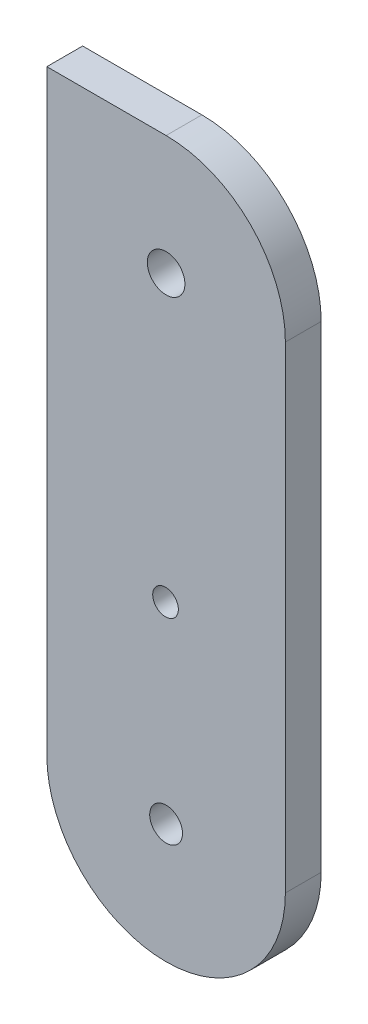
ISO-10303-21;
HEADER;
FILE_DESCRIPTION(('STEP AP214'),'2;1');
FILE_NAME('part.step','',(''),(''),'','','');
FILE_SCHEMA(('AUTOMOTIVE_DESIGN { 1 0 10303 214 1 1 1 1 }'));
ENDSEC;
DATA;
#1=APPLICATION_CONTEXT('core data for automotive mechanical design processes');
#2=APPLICATION_PROTOCOL_DEFINITION('international standard','automotive_design',2000,#1);
#3=PRODUCT_CONTEXT('',#1,'mechanical');
#4=PRODUCT('Part','Part','',(#3));
#5=PRODUCT_RELATED_PRODUCT_CATEGORY('part','',(#4));
#6=PRODUCT_DEFINITION_FORMATION('','',#4);
#7=PRODUCT_DEFINITION_CONTEXT('part definition',#1,'design');
#8=PRODUCT_DEFINITION('design','',#6,#7);
#9=PRODUCT_DEFINITION_SHAPE('','',#8);
#10=(LENGTH_UNIT() NAMED_UNIT(*) SI_UNIT(.MILLI.,.METRE.));
#11=(NAMED_UNIT(*) PLANE_ANGLE_UNIT() SI_UNIT($,.RADIAN.));
#12=(NAMED_UNIT(*) SI_UNIT($,.STERADIAN.) SOLID_ANGLE_UNIT());
#13=UNCERTAINTY_MEASURE_WITH_UNIT(LENGTH_MEASURE(1.E-05),#10,'distance_accuracy_value','');
#14=(GEOMETRIC_REPRESENTATION_CONTEXT(3) GLOBAL_UNCERTAINTY_ASSIGNED_CONTEXT((#13)) GLOBAL_UNIT_ASSIGNED_CONTEXT((#10,
#11,#12)) REPRESENTATION_CONTEXT('',''));
#15=CARTESIAN_POINT('',(0.,0.,0.));
#16=DIRECTION('',(0.,0.,1.));
#17=DIRECTION('',(1.,0.,0.));
#18=AXIS2_PLACEMENT_3D('',#15,#16,#17);
#19=CARTESIAN_POINT('',(0.,0.,0.));
#20=DIRECTION('',(0.,0.,1.));
#21=DIRECTION('',(1.,0.,0.));
#22=AXIS2_PLACEMENT_3D('',#19,#20,#21);
#23=PLANE('',#22);
#24=CARTESIAN_POINT('',(-16.2499999999998,39.1834816870754,0.));
#25=DIRECTION('',(0.,0.,1.));
#26=DIRECTION('',(1.,0.,0.));
#27=AXIS2_PLACEMENT_3D('',#24,#25,#26);
#28=CIRCLE('',#27,1.375);
#29=CARTESIAN_POINT('',(-14.8749999999998,39.1834816870754,0.));
#30=VERTEX_POINT('',#29);
#31=EDGE_CURVE('E238',#30,#30,#28,.T.);
#32=ORIENTED_EDGE('',*,*,#31,.T.);
#33=EDGE_LOOP('',(#32));
#34=FACE_BOUND('',#33,.T.);
#35=CARTESIAN_POINT('',(-16.2987805910154,55.2834077879598,0.));
#36=DIRECTION('',(0.,0.,1.));
#37=DIRECTION('',(1.,0.,0.));
#38=AXIS2_PLACEMENT_3D('',#35,#36,#37);
#39=CIRCLE('',#38,1.075);
#40=CARTESIAN_POINT('',(-15.2237805910154,55.2834077879598,0.));
#41=VERTEX_POINT('',#40);
#42=EDGE_CURVE('E207',#41,#41,#39,.T.);
#43=ORIENTED_EDGE('',*,*,#42,.T.);
#44=EDGE_LOOP('',(#43));
#45=FACE_BOUND('',#44,.T.);
#46=CARTESIAN_POINT('',(-16.2863525688093,55.9337753749668,0.));
#47=DIRECTION('',(0.,0.,1.));
#48=DIRECTION('',(1.,0.,0.));
#49=AXIS2_PLACEMENT_3D('',#46,#47,#48);
#50=CIRCLE('',#49,2.25);
#51=CARTESIAN_POINT('',(-14.0363525688093,55.9337753749668,0.));
#52=VERTEX_POINT('',#51);
#53=CARTESIAN_POINT('',(-18.5363525688092,55.9337753749668,0.));
#54=VERTEX_POINT('',#53);
#55=EDGE_CURVE('E175',#52,#54,#50,.T.);
#56=ORIENTED_EDGE('',*,*,#55,.F.);
#57=DIRECTION('',(0.106044706334431,-0.994361363015702,0.));
#58=VECTOR('',#57,1.);
#59=CARTESIAN_POINT('',(-7.98047173345626,-0.851085744942841,0.));
#60=LINE('',#59,#58);
#61=CARTESIAN_POINT('',(-12.2499999999998,39.1834816870754,0.));
#62=VERTEX_POINT('',#61);
#63=EDGE_CURVE('E140',#52,#62,#60,.T.);
#64=ORIENTED_EDGE('',*,*,#63,.T.);
#65=CARTESIAN_POINT('',(-16.2499999999998,39.1834816870754,0.));
#66=DIRECTION('',(0.,0.,1.));
#67=DIRECTION('',(1.,0.,0.));
#68=AXIS2_PLACEMENT_3D('',#65,#66,#67);
#69=CIRCLE('',#68,4.);
#70=CARTESIAN_POINT('',(-20.2499999999998,39.1834816870754,0.));
#71=VERTEX_POINT('',#70);
#72=EDGE_CURVE('E52',#71,#62,#69,.T.);
#73=ORIENTED_EDGE('',*,*,#72,.F.);
#74=DIRECTION('',(-0.101774295728011,-0.994807515416459,0.));
#75=VECTOR('',#74,1.);
#76=CARTESIAN_POINT('',(-24.0074146456353,2.45609093211064,0.));
#77=LINE('',#76,#75);
#78=EDGE_CURVE('E179',#54,#71,#77,.T.);
#79=ORIENTED_EDGE('',*,*,#78,.F.);
#80=EDGE_LOOP('',(#56,#64,#73,#79));
#81=FACE_BOUND('',#80,.T.);
#82=ADVANCED_FACE('F36',(#34,#45,#81),#23,.F.);
#83=CARTESIAN_POINT('',(-6.24999999999985,0.,3.));
#84=DIRECTION('',(1.,0.,0.));
#85=DIRECTION('',(0.,0.,-1.));
#86=AXIS2_PLACEMENT_3D('',#83,#84,#85);
#87=PLANE('',#86);
#88=DIRECTION('',(0.,-1.,0.));
#89=VECTOR('',#88,1.);
#90=CARTESIAN_POINT('',(-6.24999999999985,0.,0.));
#91=LINE('',#90,#89);
#92=CARTESIAN_POINT('',(-6.24999999999985,79.1834816870754,0.));
#93=VERTEX_POINT('',#92);
#94=CARTESIAN_POINT('',(-6.24999999999985,39.1834816870754,0.));
#95=VERTEX_POINT('',#94);
#96=EDGE_CURVE('E192',#93,#95,#91,.T.);
#97=ORIENTED_EDGE('',*,*,#96,.F.);
#98=DIRECTION('',(0.,0.,-1.));
#99=VECTOR('',#98,1.);
#100=CARTESIAN_POINT('',(-6.24999999999985,79.1834816870754,3.));
#101=LINE('',#100,#99);
#102=CARTESIAN_POINT('',(-6.24999999999985,79.1834816870754,3.));
#103=VERTEX_POINT('',#102);
#104=EDGE_CURVE('E11',#103,#93,#101,.T.);
#105=ORIENTED_EDGE('',*,*,#104,.F.);
#106=DIRECTION('',(0.,-1.,0.));
#107=VECTOR('',#106,1.);
#108=CARTESIAN_POINT('',(-6.24999999999985,0.,3.));
#109=LINE('',#108,#107);
#110=CARTESIAN_POINT('',(-6.24999999999985,39.1834816870754,3.));
#111=VERTEX_POINT('',#110);
#112=EDGE_CURVE('E203',#103,#111,#109,.T.);
#113=ORIENTED_EDGE('',*,*,#112,.T.);
#114=DIRECTION('',(0.,0.,-1.));
#115=VECTOR('',#114,1.);
#116=CARTESIAN_POINT('',(-6.24999999999985,39.1834816870754,3.));
#117=LINE('',#116,#115);
#118=EDGE_CURVE('E223',#111,#95,#117,.T.);
#119=ORIENTED_EDGE('',*,*,#118,.T.);
#120=EDGE_LOOP('',(#97,#105,#113,#119));
#121=FACE_BOUND('',#120,.T.);
#122=ADVANCED_FACE('F38',(#121),#87,.T.);
#123=CARTESIAN_POINT('',(-16.2499999999998,79.1834816870754,3.));
#124=DIRECTION('',(0.,0.,-1.));
#125=DIRECTION('',(-1.,0.,0.));
#126=AXIS2_PLACEMENT_3D('',#123,#124,#125);
#127=CYLINDRICAL_SURFACE('',#126,9.99999999999999);
#128=CARTESIAN_POINT('',(-16.2499999999998,79.1834816870754,0.));
#129=DIRECTION('',(0.,0.,1.));
#130=DIRECTION('',(1.,0.,0.));
#131=AXIS2_PLACEMENT_3D('',#128,#129,#130);
#132=CIRCLE('',#131,9.99999999999999);
#133=CARTESIAN_POINT('',(-16.2499999999998,89.1834816870754,0.));
#134=VERTEX_POINT('',#133);
#135=EDGE_CURVE('E226',#93,#134,#132,.T.);
#136=ORIENTED_EDGE('',*,*,#135,.T.);
#137=DIRECTION('',(0.,0.,-1.));
#138=VECTOR('',#137,1.);
#139=CARTESIAN_POINT('',(-16.2499999999998,89.1834816870754,3.));
#140=LINE('',#139,#138);
#141=CARTESIAN_POINT('',(-16.2499999999998,89.1834816870754,3.));
#142=VERTEX_POINT('',#141);
#143=EDGE_CURVE('E45',#142,#134,#140,.T.);
#144=ORIENTED_EDGE('',*,*,#143,.F.);
#145=CARTESIAN_POINT('',(-16.2499999999998,79.1834816870754,3.));
#146=DIRECTION('',(0.,0.,1.));
#147=DIRECTION('',(1.,0.,0.));
#148=AXIS2_PLACEMENT_3D('',#145,#146,#147);
#149=CIRCLE('',#148,9.99999999999999);
#150=EDGE_CURVE('E206',#103,#142,#149,.T.);
#151=ORIENTED_EDGE('',*,*,#150,.F.);
#152=ORIENTED_EDGE('',*,*,#104,.T.);
#153=EDGE_LOOP('',(#136,#144,#151,#152));
#154=FACE_BOUND('',#153,.T.);
#155=ADVANCED_FACE('F256',(#154),#127,.T.);
#156=CARTESIAN_POINT('',(0.,89.1834816870754,3.));
#157=DIRECTION('',(0.,1.,0.));
#158=DIRECTION('',(0.,0.,1.));
#159=AXIS2_PLACEMENT_3D('',#156,#157,#158);
#160=PLANE('',#159);
#161=DIRECTION('',(1.,0.,0.));
#162=VECTOR('',#161,1.);
#163=CARTESIAN_POINT('',(0.,89.1834816870754,0.));
#164=LINE('',#163,#162);
#165=CARTESIAN_POINT('',(-26.2499999999999,89.1834816870754,0.));
#166=VERTEX_POINT('',#165);
#167=EDGE_CURVE('E229',#166,#134,#164,.T.);
#168=ORIENTED_EDGE('',*,*,#167,.F.);
#169=DIRECTION('',(0.,0.,-1.));
#170=VECTOR('',#169,1.);
#171=CARTESIAN_POINT('',(-26.2499999999999,89.1834816870754,3.));
#172=LINE('',#171,#170);
#173=CARTESIAN_POINT('',(-26.2499999999999,89.1834816870754,3.));
#174=VERTEX_POINT('',#173);
#175=EDGE_CURVE('E246',#174,#166,#172,.T.);
#176=ORIENTED_EDGE('',*,*,#175,.F.);
#177=DIRECTION('',(1.,0.,0.));
#178=VECTOR('',#177,1.);
#179=CARTESIAN_POINT('',(0.,89.1834816870754,3.));
#180=LINE('',#179,#178);
#181=EDGE_CURVE('E209',#174,#142,#180,.T.);
#182=ORIENTED_EDGE('',*,*,#181,.T.);
#183=ORIENTED_EDGE('',*,*,#143,.T.);
#184=EDGE_LOOP('',(#168,#176,#182,#183));
#185=FACE_BOUND('',#184,.T.);
#186=ADVANCED_FACE('F251',(#185),#160,.T.);
#187=CARTESIAN_POINT('',(-26.2499999999999,0.,3.));
#188=DIRECTION('',(-1.,0.,0.));
#189=DIRECTION('',(0.,0.,1.));
#190=AXIS2_PLACEMENT_3D('',#187,#188,#189);
#191=PLANE('',#190);
#192=DIRECTION('',(0.,1.,0.));
#193=VECTOR('',#192,1.);
#194=CARTESIAN_POINT('',(-26.2499999999999,0.,0.));
#195=LINE('',#194,#193);
#196=CARTESIAN_POINT('',(-26.2499999999999,39.1834816870754,0.));
#197=VERTEX_POINT('',#196);
#198=EDGE_CURVE('E232',#197,#166,#195,.T.);
#199=ORIENTED_EDGE('',*,*,#198,.F.);
#200=DIRECTION('',(0.,0.,-1.));
#201=VECTOR('',#200,1.);
#202=CARTESIAN_POINT('',(-26.2499999999999,39.1834816870754,3.));
#203=LINE('',#202,#201);
#204=CARTESIAN_POINT('',(-26.2499999999999,39.1834816870754,3.));
#205=VERTEX_POINT('',#204);
#206=EDGE_CURVE('E244',#205,#197,#203,.T.);
#207=ORIENTED_EDGE('',*,*,#206,.F.);
#208=DIRECTION('',(0.,1.,0.));
#209=VECTOR('',#208,1.);
#210=CARTESIAN_POINT('',(-26.2499999999999,0.,3.));
#211=LINE('',#210,#209);
#212=EDGE_CURVE('E212',#205,#174,#211,.T.);
#213=ORIENTED_EDGE('',*,*,#212,.T.);
#214=ORIENTED_EDGE('',*,*,#175,.T.);
#215=EDGE_LOOP('',(#199,#207,#213,#214));
#216=FACE_BOUND('',#215,.T.);
#217=ADVANCED_FACE('F263',(#216),#191,.T.);
#218=CARTESIAN_POINT('',(-16.2499999999998,39.1834816870754,3.));
#219=DIRECTION('',(0.,0.,-1.));
#220=DIRECTION('',(-1.,0.,0.));
#221=AXIS2_PLACEMENT_3D('',#218,#219,#220);
#222=CYLINDRICAL_SURFACE('',#221,1.375);
#223=CARTESIAN_POINT('',(-16.2499999999998,39.1834816870754,3.));
#224=DIRECTION('',(0.,0.,1.));
#225=DIRECTION('',(1.,0.,0.));
#226=AXIS2_PLACEMENT_3D('',#223,#224,#225);
#227=CIRCLE('',#226,1.375);
#228=CARTESIAN_POINT('',(-14.8749999999998,39.1834816870754,3.));
#229=VERTEX_POINT('',#228);
#230=EDGE_CURVE('E217',#229,#229,#227,.T.);
#231=ORIENTED_EDGE('',*,*,#230,.T.);
#232=EDGE_LOOP('',(#231));
#233=FACE_BOUND('',#232,.T.);
#234=ORIENTED_EDGE('',*,*,#31,.F.);
#235=EDGE_LOOP('',(#234));
#236=FACE_BOUND('',#235,.T.);
#237=ADVANCED_FACE('F276',(#233,#236),#222,.F.);
#238=CARTESIAN_POINT('',(-16.2499999999998,39.1834816870754,3.));
#239=DIRECTION('',(0.,0.,-1.));
#240=DIRECTION('',(-1.,0.,0.));
#241=AXIS2_PLACEMENT_3D('',#238,#239,#240);
#242=CYLINDRICAL_SURFACE('',#241,10.);
#243=CARTESIAN_POINT('',(-16.2499999999998,39.1834816870754,0.));
#244=DIRECTION('',(0.,0.,1.));
#245=DIRECTION('',(1.,0.,0.));
#246=AXIS2_PLACEMENT_3D('',#243,#244,#245);
#247=CIRCLE('',#246,10.);
#248=EDGE_CURVE('E235',#197,#95,#247,.T.);
#249=ORIENTED_EDGE('',*,*,#248,.T.);
#250=ORIENTED_EDGE('',*,*,#118,.F.);
#251=CARTESIAN_POINT('',(-16.2499999999998,39.1834816870754,3.));
#252=DIRECTION('',(0.,0.,1.));
#253=DIRECTION('',(1.,0.,0.));
#254=AXIS2_PLACEMENT_3D('',#251,#252,#253);
#255=CIRCLE('',#254,10.);
#256=EDGE_CURVE('E215',#205,#111,#255,.T.);
#257=ORIENTED_EDGE('',*,*,#256,.F.);
#258=ORIENTED_EDGE('',*,*,#206,.T.);
#259=EDGE_LOOP('',(#249,#250,#257,#258));
#260=FACE_BOUND('',#259,.T.);
#261=ADVANCED_FACE('F273',(#260),#242,.T.);
#262=CARTESIAN_POINT('',(-16.2987805910154,55.2834077879598,3.));
#263=DIRECTION('',(0.,0.,-1.));
#264=DIRECTION('',(-1.,0.,0.));
#265=AXIS2_PLACEMENT_3D('',#262,#263,#264);
#266=CYLINDRICAL_SURFACE('',#265,1.075);
#267=CARTESIAN_POINT('',(-16.2987805910154,55.2834077879598,3.));
#268=DIRECTION('',(0.,0.,1.));
#269=DIRECTION('',(1.,0.,0.));
#270=AXIS2_PLACEMENT_3D('',#267,#268,#269);
#271=CIRCLE('',#270,1.075);
#272=CARTESIAN_POINT('',(-15.2237805910154,55.2834077879598,3.));
#273=VERTEX_POINT('',#272);
#274=EDGE_CURVE('E220',#273,#273,#271,.T.);
#275=ORIENTED_EDGE('',*,*,#274,.T.);
#276=EDGE_LOOP('',(#275));
#277=FACE_BOUND('',#276,.T.);
#278=ORIENTED_EDGE('',*,*,#42,.F.);
#279=EDGE_LOOP('',(#278));
#280=FACE_BOUND('',#279,.T.);
#281=ADVANCED_FACE('F275',(#277,#280),#266,.F.);
#282=CARTESIAN_POINT('',(0.,0.,3.));
#283=DIRECTION('',(0.,0.,1.));
#284=DIRECTION('',(1.,0.,0.));
#285=AXIS2_PLACEMENT_3D('',#282,#283,#284);
#286=PLANE('',#285);
#287=CARTESIAN_POINT('',(-16.2499999999998,79.1834816870754,3.));
#288=DIRECTION('',(0.,0.,1.));
#289=DIRECTION('',(1.,0.,0.));
#290=AXIS2_PLACEMENT_3D('',#287,#288,#289);
#291=CIRCLE('',#290,1.57500000000001);
#292=CARTESIAN_POINT('',(-14.6749999999998,79.1834816870754,3.));
#293=VERTEX_POINT('',#292);
#294=EDGE_CURVE('E482',#293,#293,#291,.T.);
#295=ORIENTED_EDGE('',*,*,#294,.F.);
#296=EDGE_LOOP('',(#295));
#297=FACE_BOUND('',#296,.T.);
#298=ORIENTED_EDGE('',*,*,#112,.F.);
#299=ORIENTED_EDGE('',*,*,#150,.T.);
#300=ORIENTED_EDGE('',*,*,#181,.F.);
#301=ORIENTED_EDGE('',*,*,#212,.F.);
#302=ORIENTED_EDGE('',*,*,#256,.T.);
#303=EDGE_LOOP('',(#298,#299,#300,#301,#302));
#304=FACE_BOUND('',#303,.T.);
#305=ORIENTED_EDGE('',*,*,#230,.F.);
#306=EDGE_LOOP('',(#305));
#307=FACE_BOUND('',#306,.T.);
#308=ORIENTED_EDGE('',*,*,#274,.F.);
#309=EDGE_LOOP('',(#308));
#310=FACE_BOUND('',#309,.T.);
#311=ADVANCED_FACE('F268',(#297,#304,#307,#310),#286,.T.);
#312=CARTESIAN_POINT('',(-16.2499999999998,79.1834816870754,0.));
#313=DIRECTION('',(0.,0.,1.));
#314=DIRECTION('',(1.,0.,0.));
#315=AXIS2_PLACEMENT_3D('',#312,#313,#314);
#316=CIRCLE('',#315,1.57500000000001);
#317=CARTESIAN_POINT('',(-14.6749999999998,79.1834816870754,0.));
#318=VERTEX_POINT('',#317);
#319=EDGE_CURVE('E40',#318,#318,#316,.T.);
#320=ORIENTED_EDGE('',*,*,#319,.T.);
#321=EDGE_LOOP('',(#320));
#322=FACE_BOUND('',#321,.T.);
#323=CARTESIAN_POINT('',(-16.2863525688093,55.9337753749668,0.));
#324=DIRECTION('',(0.,0.,1.));
#325=DIRECTION('',(1.,0.,0.));
#326=AXIS2_PLACEMENT_3D('',#323,#324,#325);
#327=CIRCLE('',#326,3.25);
#328=CARTESIAN_POINT('',(-13.0368706955205,55.9918060148716,0.));
#329=VERTEX_POINT('',#328);
#330=CARTESIAN_POINT('',(-19.5358755271931,55.9894578940933,0.));
#331=VERTEX_POINT('',#330);
#332=EDGE_CURVE('E153',#329,#331,#327,.T.);
#333=ORIENTED_EDGE('',*,*,#332,.T.);
#334=DIRECTION('',(-0.101774295728011,-0.994807515416459,0.));
#335=VECTOR('',#334,1.);
#336=CARTESIAN_POINT('',(-25.0022221610518,2.55786522783865,0.));
#337=LINE('',#336,#335);
#338=CARTESIAN_POINT('',(-21.2497099592287,39.2373363395029,0.));
#339=VERTEX_POINT('',#338);
#340=EDGE_CURVE('E181',#331,#339,#337,.T.);
#341=ORIENTED_EDGE('',*,*,#340,.T.);
#342=CARTESIAN_POINT('',(-16.2499999999998,39.1834816870754,0.));
#343=DIRECTION('',(0.,0.,1.));
#344=DIRECTION('',(1.,0.,0.));
#345=AXIS2_PLACEMENT_3D('',#342,#343,#344);
#346=CIRCLE('',#345,5.);
#347=CARTESIAN_POINT('',(-11.2503150248658,39.2396078789914,0.));
#348=VERTEX_POINT('',#347);
#349=EDGE_CURVE('E184',#339,#348,#346,.T.);
#350=ORIENTED_EDGE('',*,*,#349,.T.);
#351=DIRECTION('',(0.106044706334431,-0.994361363015702,0.));
#352=VECTOR('',#351,1.);
#353=CARTESIAN_POINT('',(-6.98611037044056,-0.74504103860841,0.));
#354=LINE('',#353,#352);
#355=EDGE_CURVE('E60',#329,#348,#354,.T.);
#356=ORIENTED_EDGE('',*,*,#355,.F.);
#357=EDGE_LOOP('',(#333,#341,#350,#356));
#358=FACE_BOUND('',#357,.T.);
#359=ORIENTED_EDGE('',*,*,#96,.T.);
#360=ORIENTED_EDGE('',*,*,#248,.F.);
#361=ORIENTED_EDGE('',*,*,#198,.T.);
#362=ORIENTED_EDGE('',*,*,#167,.T.);
#363=ORIENTED_EDGE('',*,*,#135,.F.);
#364=EDGE_LOOP('',(#359,#360,#361,#362,#363));
#365=FACE_BOUND('',#364,.T.);
#366=ADVANCED_FACE('F259',(#322,#358,#365),#23,.F.);
#367=CARTESIAN_POINT('',(-25.0022221610518,2.55786522783865,-4.));
#368=DIRECTION('',(-0.994807515416459,0.101774295728011,0.));
#369=DIRECTION('',(-0.101774295728011,-0.994807515416459,0.));
#370=AXIS2_PLACEMENT_3D('',#367,#368,#369);
#371=PLANE('',#370);
#372=ORIENTED_EDGE('',*,*,#340,.F.);
#373=DIRECTION('',(0.,0.,1.));
#374=VECTOR('',#373,1.);
#375=CARTESIAN_POINT('',(-19.5358755271931,55.9894578940933,-4.));
#376=LINE('',#375,#374);
#377=CARTESIAN_POINT('',(-19.5358755271931,55.9894578940933,-4.));
#378=VERTEX_POINT('',#377);
#379=EDGE_CURVE('E190',#378,#331,#376,.T.);
#380=ORIENTED_EDGE('',*,*,#379,.F.);
#381=DIRECTION('',(-0.101774295728011,-0.994807515416459,0.));
#382=VECTOR('',#381,1.);
#383=CARTESIAN_POINT('',(-25.0022221610518,2.55786522783865,-4.));
#384=LINE('',#383,#382);
#385=CARTESIAN_POINT('',(-21.2497099592287,39.2373363395029,-4.));
#386=VERTEX_POINT('',#385);
#387=EDGE_CURVE('E165',#378,#386,#384,.T.);
#388=ORIENTED_EDGE('',*,*,#387,.T.);
#389=DIRECTION('',(0.,0.,1.));
#390=VECTOR('',#389,1.);
#391=CARTESIAN_POINT('',(-21.2497099592287,39.2373363395029,-4.));
#392=LINE('',#391,#390);
#393=EDGE_CURVE('E197',#386,#339,#392,.T.);
#394=ORIENTED_EDGE('',*,*,#393,.T.);
#395=EDGE_LOOP('',(#372,#380,#388,#394));
#396=FACE_BOUND('',#395,.T.);
#397=ADVANCED_FACE('F296',(#396),#371,.T.);
#398=CARTESIAN_POINT('',(-16.2863525688093,55.9337753749668,-4.));
#399=DIRECTION('',(0.,0.,1.));
#400=DIRECTION('',(1.,0.,0.));
#401=AXIS2_PLACEMENT_3D('',#398,#399,#400);
#402=CYLINDRICAL_SURFACE('',#401,3.25);
#403=ORIENTED_EDGE('',*,*,#332,.F.);
#404=DIRECTION('',(0.,0.,1.));
#405=VECTOR('',#404,1.);
#406=CARTESIAN_POINT('',(-13.0368706955205,55.9918060148716,-4.));
#407=LINE('',#406,#405);
#408=CARTESIAN_POINT('',(-13.0368706955205,55.9918060148716,-4.));
#409=VERTEX_POINT('',#408);
#410=EDGE_CURVE('E193',#409,#329,#407,.T.);
#411=ORIENTED_EDGE('',*,*,#410,.F.);
#412=CARTESIAN_POINT('',(-16.2863525688093,55.9337753749668,-4.));
#413=DIRECTION('',(0.,0.,1.));
#414=DIRECTION('',(1.,0.,0.));
#415=AXIS2_PLACEMENT_3D('',#412,#413,#414);
#416=CIRCLE('',#415,3.25);
#417=EDGE_CURVE('E145',#409,#378,#416,.T.);
#418=ORIENTED_EDGE('',*,*,#417,.T.);
#419=ORIENTED_EDGE('',*,*,#379,.T.);
#420=EDGE_LOOP('',(#403,#411,#418,#419));
#421=FACE_BOUND('',#420,.T.);
#422=ADVANCED_FACE('F302',(#421),#402,.T.);
#423=CARTESIAN_POINT('',(-6.98611037044056,-0.74504103860841,-4.));
#424=DIRECTION('',(-0.994361363015702,-0.106044706334431,0.));
#425=DIRECTION('',(0.106044706334431,-0.994361363015702,0.));
#426=AXIS2_PLACEMENT_3D('',#423,#424,#425);
#427=PLANE('',#426);
#428=ORIENTED_EDGE('',*,*,#355,.T.);
#429=DIRECTION('',(0.,0.,1.));
#430=VECTOR('',#429,1.);
#431=CARTESIAN_POINT('',(-11.2503150248658,39.2396078789914,-4.));
#432=LINE('',#431,#430);
#433=CARTESIAN_POINT('',(-11.2503150248658,39.2396078789914,-4.));
#434=VERTEX_POINT('',#433);
#435=EDGE_CURVE('E195',#434,#348,#432,.T.);
#436=ORIENTED_EDGE('',*,*,#435,.F.);
#437=DIRECTION('',(0.106044706334431,-0.994361363015702,0.));
#438=VECTOR('',#437,1.);
#439=CARTESIAN_POINT('',(-6.98611037044056,-0.74504103860841,-4.));
#440=LINE('',#439,#438);
#441=EDGE_CURVE('E171',#409,#434,#440,.T.);
#442=ORIENTED_EDGE('',*,*,#441,.F.);
#443=ORIENTED_EDGE('',*,*,#410,.T.);
#444=EDGE_LOOP('',(#428,#436,#442,#443));
#445=FACE_BOUND('',#444,.T.);
#446=ADVANCED_FACE('F319',(#445),#427,.F.);
#447=CARTESIAN_POINT('',(-16.2863525688093,55.9337753749668,-4.));
#448=DIRECTION('',(0.,0.,1.));
#449=DIRECTION('',(1.,0.,0.));
#450=AXIS2_PLACEMENT_3D('',#447,#448,#449);
#451=CYLINDRICAL_SURFACE('',#450,2.25);
#452=ORIENTED_EDGE('',*,*,#55,.T.);
#453=DIRECTION('',(0.,0.,1.));
#454=VECTOR('',#453,1.);
#455=CARTESIAN_POINT('',(-18.5363525688092,55.9337753749668,-4.));
#456=LINE('',#455,#454);
#457=CARTESIAN_POINT('',(-18.5363525688092,55.9337753749668,-4.));
#458=VERTEX_POINT('',#457);
#459=EDGE_CURVE('E151',#458,#54,#456,.T.);
#460=ORIENTED_EDGE('',*,*,#459,.F.);
#461=CARTESIAN_POINT('',(-16.2863525688093,55.9337753749668,-4.));
#462=DIRECTION('',(0.,0.,1.));
#463=DIRECTION('',(1.,0.,0.));
#464=AXIS2_PLACEMENT_3D('',#461,#462,#463);
#465=CIRCLE('',#464,2.25);
#466=CARTESIAN_POINT('',(-14.0363525688093,55.9337753749668,-4.));
#467=VERTEX_POINT('',#466);
#468=EDGE_CURVE('E149',#467,#458,#465,.T.);
#469=ORIENTED_EDGE('',*,*,#468,.F.);
#470=DIRECTION('',(0.,0.,1.));
#471=VECTOR('',#470,1.);
#472=CARTESIAN_POINT('',(-14.0363525688093,55.9337753749668,-4.));
#473=LINE('',#472,#471);
#474=EDGE_CURVE('E134',#467,#52,#473,.T.);
#475=ORIENTED_EDGE('',*,*,#474,.T.);
#476=EDGE_LOOP('',(#452,#460,#469,#475));
#477=FACE_BOUND('',#476,.T.);
#478=ADVANCED_FACE('F150',(#477),#451,.F.);
#479=CARTESIAN_POINT('',(-24.0074146456353,2.45609093211064,-4.));
#480=DIRECTION('',(-0.994807515416459,0.101774295728011,0.));
#481=DIRECTION('',(-0.101774295728011,-0.994807515416459,0.));
#482=AXIS2_PLACEMENT_3D('',#479,#480,#481);
#483=PLANE('',#482);
#484=ORIENTED_EDGE('',*,*,#78,.T.);
#485=DIRECTION('',(0.,0.,1.));
#486=VECTOR('',#485,1.);
#487=CARTESIAN_POINT('',(-20.2499999999998,39.1834816870754,-4.));
#488=LINE('',#487,#486);
#489=CARTESIAN_POINT('',(-20.2499999999998,39.1834816870754,-4.));
#490=VERTEX_POINT('',#489);
#491=EDGE_CURVE('E200',#490,#71,#488,.T.);
#492=ORIENTED_EDGE('',*,*,#491,.F.);
#493=DIRECTION('',(-0.101774295728011,-0.994807515416459,0.));
#494=VECTOR('',#493,1.);
#495=CARTESIAN_POINT('',(-24.0074146456353,2.45609093211064,-4.));
#496=LINE('',#495,#494);
#497=EDGE_CURVE('E160',#458,#490,#496,.T.);
#498=ORIENTED_EDGE('',*,*,#497,.F.);
#499=ORIENTED_EDGE('',*,*,#459,.T.);
#500=EDGE_LOOP('',(#484,#492,#498,#499));
#501=FACE_BOUND('',#500,.T.);
#502=ADVANCED_FACE('F335',(#501),#483,.F.);
#503=CARTESIAN_POINT('',(-16.2499999999998,39.1834816870754,-4.));
#504=DIRECTION('',(0.,0.,1.));
#505=DIRECTION('',(1.,0.,0.));
#506=AXIS2_PLACEMENT_3D('',#503,#504,#505);
#507=CYLINDRICAL_SURFACE('',#506,4.);
#508=ORIENTED_EDGE('',*,*,#72,.T.);
#509=DIRECTION('',(0.,0.,1.));
#510=VECTOR('',#509,1.);
#511=CARTESIAN_POINT('',(-12.2499999999998,39.1834816870754,-4.));
#512=LINE('',#511,#510);
#513=CARTESIAN_POINT('',(-12.2499999999998,39.1834816870754,-4.));
#514=VERTEX_POINT('',#513);
#515=EDGE_CURVE('E144',#514,#62,#512,.T.);
#516=ORIENTED_EDGE('',*,*,#515,.F.);
#517=CARTESIAN_POINT('',(-16.2499999999998,39.1834816870754,-4.));
#518=DIRECTION('',(0.,0.,1.));
#519=DIRECTION('',(1.,0.,0.));
#520=AXIS2_PLACEMENT_3D('',#517,#518,#519);
#521=CIRCLE('',#520,4.);
#522=EDGE_CURVE('E158',#490,#514,#521,.T.);
#523=ORIENTED_EDGE('',*,*,#522,.F.);
#524=ORIENTED_EDGE('',*,*,#491,.T.);
#525=EDGE_LOOP('',(#508,#516,#523,#524));
#526=FACE_BOUND('',#525,.T.);
#527=ADVANCED_FACE('F338',(#526),#507,.F.);
#528=CARTESIAN_POINT('',(-7.98047173345626,-0.851085744942841,-4.));
#529=DIRECTION('',(-0.994361363015702,-0.106044706334431,0.));
#530=DIRECTION('',(0.106044706334431,-0.994361363015702,0.));
#531=AXIS2_PLACEMENT_3D('',#528,#529,#530);
#532=PLANE('',#531);
#533=ORIENTED_EDGE('',*,*,#63,.F.);
#534=ORIENTED_EDGE('',*,*,#474,.F.);
#535=DIRECTION('',(0.106044706334431,-0.994361363015702,0.));
#536=VECTOR('',#535,1.);
#537=CARTESIAN_POINT('',(-7.98047173345626,-0.851085744942841,-4.));
#538=LINE('',#537,#536);
#539=EDGE_CURVE('E138',#467,#514,#538,.T.);
#540=ORIENTED_EDGE('',*,*,#539,.T.);
#541=ORIENTED_EDGE('',*,*,#515,.T.);
#542=EDGE_LOOP('',(#533,#534,#540,#541));
#543=FACE_BOUND('',#542,.T.);
#544=ADVANCED_FACE('F136',(#543),#532,.T.);
#545=CARTESIAN_POINT('',(-16.2499999999998,39.1834816870754,-4.));
#546=DIRECTION('',(0.,0.,1.));
#547=DIRECTION('',(1.,0.,0.));
#548=AXIS2_PLACEMENT_3D('',#545,#546,#547);
#549=CYLINDRICAL_SURFACE('',#548,5.);
#550=ORIENTED_EDGE('',*,*,#349,.F.);
#551=ORIENTED_EDGE('',*,*,#393,.F.);
#552=CARTESIAN_POINT('',(-16.2499999999998,39.1834816870754,-4.));
#553=DIRECTION('',(0.,0.,1.));
#554=DIRECTION('',(1.,0.,0.));
#555=AXIS2_PLACEMENT_3D('',#552,#553,#554);
#556=CIRCLE('',#555,5.);
#557=EDGE_CURVE('E168',#386,#434,#556,.T.);
#558=ORIENTED_EDGE('',*,*,#557,.T.);
#559=ORIENTED_EDGE('',*,*,#435,.T.);
#560=EDGE_LOOP('',(#550,#551,#558,#559));
#561=FACE_BOUND('',#560,.T.);
#562=ADVANCED_FACE('F318',(#561),#549,.T.);
#563=CARTESIAN_POINT('',(0.,0.,-4.));
#564=DIRECTION('',(0.,0.,1.));
#565=DIRECTION('',(1.,0.,0.));
#566=AXIS2_PLACEMENT_3D('',#563,#564,#565);
#567=PLANE('',#566);
#568=ORIENTED_EDGE('',*,*,#468,.T.);
#569=ORIENTED_EDGE('',*,*,#497,.T.);
#570=ORIENTED_EDGE('',*,*,#522,.T.);
#571=ORIENTED_EDGE('',*,*,#539,.F.);
#572=EDGE_LOOP('',(#568,#569,#570,#571));
#573=FACE_BOUND('',#572,.T.);
#574=ORIENTED_EDGE('',*,*,#387,.F.);
#575=ORIENTED_EDGE('',*,*,#417,.F.);
#576=ORIENTED_EDGE('',*,*,#441,.T.);
#577=ORIENTED_EDGE('',*,*,#557,.F.);
#578=EDGE_LOOP('',(#574,#575,#576,#577));
#579=FACE_BOUND('',#578,.T.);
#580=ADVANCED_FACE('F155',(#573,#579),#567,.F.);
#581=CARTESIAN_POINT('',(-16.2499999999998,79.1834816870754,-7.));
#582=DIRECTION('',(0.,0.,1.));
#583=DIRECTION('',(1.,0.,0.));
#584=AXIS2_PLACEMENT_3D('',#581,#582,#583);
#585=CYLINDRICAL_SURFACE('',#584,1.57500000000001);
#586=ORIENTED_EDGE('',*,*,#294,.T.);
#587=EDGE_LOOP('',(#586));
#588=FACE_BOUND('',#587,.T.);
#589=ORIENTED_EDGE('',*,*,#319,.F.);
#590=EDGE_LOOP('',(#589));
#591=FACE_BOUND('',#590,.T.);
#592=ADVANCED_FACE('F321',(#588,#591),#585,.F.);
#593=CLOSED_SHELL('',(#82,#122,#155,#186,#217,#237,#261,#281,#311,#366,#397,#422,#446,#478,#502,
#527,#544,#562,#580,#592));
#594=MANIFOLD_SOLID_BREP('B2',#593);
#595=ADVANCED_BREP_SHAPE_REPRESENTATION('',(#18,#594),#14);
#596=SHAPE_DEFINITION_REPRESENTATION(#9,#595);
ENDSEC;
END-ISO-10303-21;
